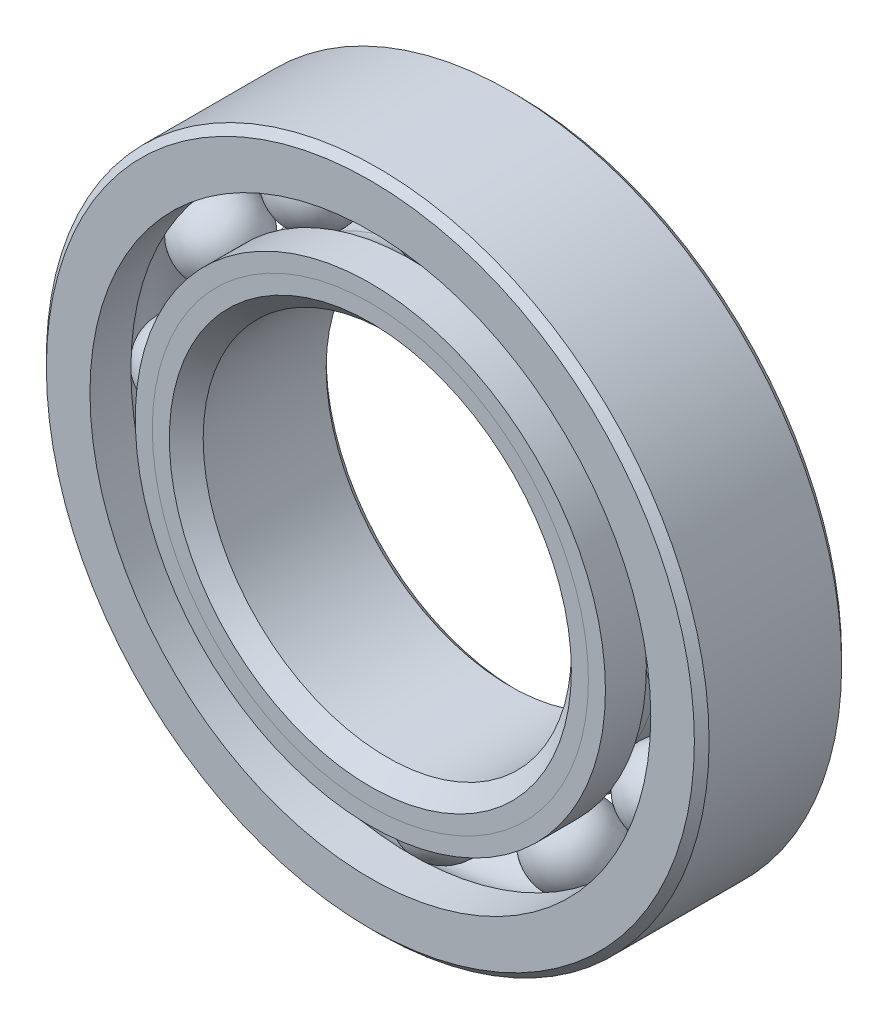
ISO-10303-21;
HEADER;
FILE_DESCRIPTION(('STEP AP214'),'2;1');
FILE_NAME('part.step','',(''),(''),'','','');
FILE_SCHEMA(('AUTOMOTIVE_DESIGN { 1 0 10303 214 1 1 1 1 }'));
ENDSEC;
DATA;
#1=APPLICATION_CONTEXT('core data for automotive mechanical design processes');
#2=APPLICATION_PROTOCOL_DEFINITION('international standard','automotive_design',2000,#1);
#3=PRODUCT_CONTEXT('',#1,'mechanical');
#4=PRODUCT('Part','Part','',(#3));
#5=PRODUCT_RELATED_PRODUCT_CATEGORY('part','',(#4));
#6=PRODUCT_DEFINITION_FORMATION('','',#4);
#7=PRODUCT_DEFINITION_CONTEXT('part definition',#1,'design');
#8=PRODUCT_DEFINITION('design','',#6,#7);
#9=PRODUCT_DEFINITION_SHAPE('','',#8);
#10=(LENGTH_UNIT() NAMED_UNIT(*) SI_UNIT(.MILLI.,.METRE.));
#11=(NAMED_UNIT(*) PLANE_ANGLE_UNIT() SI_UNIT($,.RADIAN.));
#12=(NAMED_UNIT(*) SI_UNIT($,.STERADIAN.) SOLID_ANGLE_UNIT());
#13=UNCERTAINTY_MEASURE_WITH_UNIT(LENGTH_MEASURE(1.E-05),#10,'distance_accuracy_value','');
#14=(GEOMETRIC_REPRESENTATION_CONTEXT(3) GLOBAL_UNCERTAINTY_ASSIGNED_CONTEXT((#13)) GLOBAL_UNIT_ASSIGNED_CONTEXT((#10,
#11,#12)) REPRESENTATION_CONTEXT('',''));
#15=CARTESIAN_POINT('',(0.,0.,0.));
#16=DIRECTION('',(0.,0.,1.));
#17=DIRECTION('',(1.,0.,0.));
#18=AXIS2_PLACEMENT_3D('',#15,#16,#17);
#19=CARTESIAN_POINT('',(-5.55624999999988,9.62370729955465,0.));
#20=DIRECTION('',(0.,0.,1.));
#21=DIRECTION('',(-0.499999999999989,0.866025403784445,0.));
#22=AXIS2_PLACEMENT_3D('',#19,#20,#21);
#23=SPHERICAL_SURFACE('',#22,1.71627890103155);
#24=CARTESIAN_POINT('',(-5.55624999999988,9.62370729955465,1.71627890103155));
#25=VERTEX_POINT('',#24);
#26=VERTEX_LOOP('',#25);
#27=FACE_BOUND('',#26,.T.);
#28=ADVANCED_FACE('F41',(#27),#23,.T.);
#29=CLOSED_SHELL('',(#28));
#30=MANIFOLD_SOLID_BREP('B2',#29);
#31=CARTESIAN_POINT('',(-9.62370729955451,5.55625000000011,0.));
#32=DIRECTION('',(0.,0.,1.));
#33=DIRECTION('',(-0.866025403784433,0.50000000000001,0.));
#34=AXIS2_PLACEMENT_3D('',#31,#32,#33);
#35=SPHERICAL_SURFACE('',#34,1.71627890103155);
#36=CARTESIAN_POINT('',(-9.62370729955451,5.55625000000011,1.71627890103155));
#37=VERTEX_POINT('',#36);
#38=VERTEX_LOOP('',#37);
#39=FACE_BOUND('',#38,.T.);
#40=ADVANCED_FACE('F76',(#39),#35,.T.);
#41=CLOSED_SHELL('',(#40));
#42=MANIFOLD_SOLID_BREP('B6',#41);
#43=CARTESIAN_POINT('',(-11.1125,1.16397259133683E-13,0.));
#44=DIRECTION('',(0.,0.,1.));
#45=DIRECTION('',(-1.,0.,0.));
#46=AXIS2_PLACEMENT_3D('',#43,#44,#45);
#47=SPHERICAL_SURFACE('',#46,1.71627890103155);
#48=CARTESIAN_POINT('',(-11.1125,1.16397259133683E-13,1.71627890103155));
#49=VERTEX_POINT('',#48);
#50=VERTEX_LOOP('',#49);
#51=FACE_BOUND('',#50,.T.);
#52=ADVANCED_FACE('F111',(#51),#47,.T.);
#53=CLOSED_SHELL('',(#52));
#54=MANIFOLD_SOLID_BREP('B37',#53);
#55=CARTESIAN_POINT('',(-9.62370729955463,-5.55624999999991,0.));
#56=DIRECTION('',(0.,0.,1.));
#57=DIRECTION('',(-0.866025403784443,-0.499999999999992,0.));
#58=AXIS2_PLACEMENT_3D('',#55,#56,#57);
#59=SPHERICAL_SURFACE('',#58,1.71627890103155);
#60=CARTESIAN_POINT('',(-9.62370729955463,-5.55624999999991,1.71627890103155));
#61=VERTEX_POINT('',#60);
#62=VERTEX_LOOP('',#61);
#63=FACE_BOUND('',#62,.T.);
#64=ADVANCED_FACE('F146',(#63),#59,.T.);
#65=CLOSED_SHELL('',(#64));
#66=MANIFOLD_SOLID_BREP('B72',#65);
#67=CARTESIAN_POINT('',(-5.55625000000008,-9.62370729955453,0.));
#68=DIRECTION('',(0.,0.,1.));
#69=DIRECTION('',(-0.500000000000007,-0.866025403784435,0.));
#70=AXIS2_PLACEMENT_3D('',#67,#68,#69);
#71=SPHERICAL_SURFACE('',#70,1.71627890103155);
#72=CARTESIAN_POINT('',(-5.55625000000008,-9.62370729955453,1.71627890103155));
#73=VERTEX_POINT('',#72);
#74=VERTEX_LOOP('',#73);
#75=FACE_BOUND('',#74,.T.);
#76=ADVANCED_FACE('F181',(#75),#71,.T.);
#77=CLOSED_SHELL('',(#76));
#78=MANIFOLD_SOLID_BREP('B107',#77);
#79=CARTESIAN_POINT('',(0.,-11.1125,0.));
#80=DIRECTION('',(0.,0.,1.));
#81=DIRECTION('',(0.,-1.,0.));
#82=AXIS2_PLACEMENT_3D('',#79,#80,#81);
#83=SPHERICAL_SURFACE('',#82,1.71627890103155);
#84=CARTESIAN_POINT('',(0.,-11.1125,1.71627890103155));
#85=VERTEX_POINT('',#84);
#86=VERTEX_LOOP('',#85);
#87=FACE_BOUND('',#86,.T.);
#88=ADVANCED_FACE('F216',(#87),#83,.T.);
#89=CLOSED_SHELL('',(#88));
#90=MANIFOLD_SOLID_BREP('B142',#89);
#91=CARTESIAN_POINT('',(5.55624999999994,-9.62370729955461,0.));
#92=DIRECTION('',(0.,0.,1.));
#93=DIRECTION('',(0.499999999999995,-0.866025403784442,0.));
#94=AXIS2_PLACEMENT_3D('',#91,#92,#93);
#95=SPHERICAL_SURFACE('',#94,1.71627890103155);
#96=CARTESIAN_POINT('',(5.55624999999994,-9.62370729955461,1.71627890103155));
#97=VERTEX_POINT('',#96);
#98=VERTEX_LOOP('',#97);
#99=FACE_BOUND('',#98,.T.);
#100=ADVANCED_FACE('F251',(#99),#95,.T.);
#101=CLOSED_SHELL('',(#100));
#102=MANIFOLD_SOLID_BREP('B177',#101);
#103=CARTESIAN_POINT('',(9.62370729955455,-5.55625000000005,0.));
#104=DIRECTION('',(0.,0.,1.));
#105=DIRECTION('',(0.866025403784436,-0.500000000000004,0.));
#106=AXIS2_PLACEMENT_3D('',#103,#104,#105);
#107=SPHERICAL_SURFACE('',#106,1.71627890103155);
#108=CARTESIAN_POINT('',(9.62370729955455,-5.55625000000005,1.71627890103155));
#109=VERTEX_POINT('',#108);
#110=VERTEX_LOOP('',#109);
#111=FACE_BOUND('',#110,.T.);
#112=ADVANCED_FACE('F286',(#111),#107,.T.);
#113=CLOSED_SHELL('',(#112));
#114=MANIFOLD_SOLID_BREP('B212',#113);
#115=CARTESIAN_POINT('',(11.1125,0.,0.));
#116=DIRECTION('',(0.,0.,1.));
#117=DIRECTION('',(1.,0.,0.));
#118=AXIS2_PLACEMENT_3D('',#115,#116,#117);
#119=SPHERICAL_SURFACE('',#118,1.71627890103155);
#120=CARTESIAN_POINT('',(11.1125,0.,1.71627890103155));
#121=VERTEX_POINT('',#120);
#122=VERTEX_LOOP('',#121);
#123=FACE_BOUND('',#122,.T.);
#124=ADVANCED_FACE('F321',(#123),#119,.T.);
#125=CLOSED_SHELL('',(#124));
#126=MANIFOLD_SOLID_BREP('B247',#125);
#127=CARTESIAN_POINT('',(9.62370729955459,5.55624999999998,0.));
#128=DIRECTION('',(0.,0.,1.));
#129=DIRECTION('',(0.86602540378444,0.499999999999998,0.));
#130=AXIS2_PLACEMENT_3D('',#127,#128,#129);
#131=SPHERICAL_SURFACE('',#130,1.71627890103155);
#132=CARTESIAN_POINT('',(9.62370729955459,5.55624999999998,1.71627890103155));
#133=VERTEX_POINT('',#132);
#134=VERTEX_LOOP('',#133);
#135=FACE_BOUND('',#134,.T.);
#136=ADVANCED_FACE('F356',(#135),#131,.T.);
#137=CLOSED_SHELL('',(#136));
#138=MANIFOLD_SOLID_BREP('B282',#137);
#139=CARTESIAN_POINT('',(5.55625000000001,9.62370729955457,0.));
#140=DIRECTION('',(0.,0.,1.));
#141=DIRECTION('',(0.500000000000001,0.866025403784438,0.));
#142=AXIS2_PLACEMENT_3D('',#139,#140,#141);
#143=SPHERICAL_SURFACE('',#142,1.71627890103155);
#144=CARTESIAN_POINT('',(5.55625000000001,9.62370729955457,1.71627890103155));
#145=VERTEX_POINT('',#144);
#146=VERTEX_LOOP('',#145);
#147=FACE_BOUND('',#146,.T.);
#148=ADVANCED_FACE('F391',(#147),#143,.T.);
#149=CLOSED_SHELL('',(#148));
#150=MANIFOLD_SOLID_BREP('B317',#149);
#151=CARTESIAN_POINT('',(0.,11.1125,0.));
#152=DIRECTION('',(0.,0.,1.));
#153=DIRECTION('',(0.,1.,0.));
#154=AXIS2_PLACEMENT_3D('',#151,#152,#153);
#155=SPHERICAL_SURFACE('',#154,1.71627890103155);
#156=CARTESIAN_POINT('',(0.,11.1125,1.71627890103155));
#157=VERTEX_POINT('',#156);
#158=VERTEX_LOOP('',#157);
#159=FACE_BOUND('',#158,.T.);
#160=ADVANCED_FACE('F428',(#159),#155,.T.);
#161=CLOSED_SHELL('',(#160));
#162=MANIFOLD_SOLID_BREP('B352',#161);
#163=CARTESIAN_POINT('',(0.,9.40121873628058,3.175));
#164=DIRECTION('',(0.,0.,-1.));
#165=DIRECTION('',(-1.,0.,0.));
#166=AXIS2_PLACEMENT_3D('',#163,#164,#165);
#167=PLANE('',#166);
#168=CARTESIAN_POINT('',(0.,0.,3.175));
#169=DIRECTION('',(0.,0.,1.));
#170=DIRECTION('',(1.,0.,0.));
#171=AXIS2_PLACEMENT_3D('',#168,#169,#170);
#172=CIRCLE('',#171,8.66686054948422);
#173=CARTESIAN_POINT('',(8.66686054948422,0.,3.175));
#174=VERTEX_POINT('',#173);
#175=EDGE_CURVE('E484',#174,#174,#172,.T.);
#176=ORIENTED_EDGE('',*,*,#175,.F.);
#177=EDGE_LOOP('',(#176));
#178=FACE_BOUND('',#177,.T.);
#179=CARTESIAN_POINT('',(0.,0.,3.175));
#180=DIRECTION('',(0.,0.,1.));
#181=DIRECTION('',(1.,0.,0.));
#182=AXIS2_PLACEMENT_3D('',#179,#180,#181);
#183=CIRCLE('',#182,9.40121873628058);
#184=CARTESIAN_POINT('',(9.40121873628058,0.,3.175));
#185=VERTEX_POINT('',#184);
#186=EDGE_CURVE('E427',#185,#185,#183,.T.);
#187=ORIENTED_EDGE('',*,*,#186,.T.);
#188=EDGE_LOOP('',(#187));
#189=FACE_BOUND('',#188,.T.);
#190=ADVANCED_FACE('F450',(#178,#189),#167,.F.);
#191=CARTESIAN_POINT('',(0.,0.,2.44064181320365));
#192=DIRECTION('',(0.,0.,1.));
#193=DIRECTION('',(1.,0.,0.));
#194=AXIS2_PLACEMENT_3D('',#191,#192,#193);
#195=CONICAL_SURFACE('',#194,8.66686054948422,0.785398163397451);
#196=ORIENTED_EDGE('',*,*,#186,.F.);
#197=EDGE_LOOP('',(#196));
#198=FACE_BOUND('',#197,.T.);
#199=CARTESIAN_POINT('',(0.,0.,2.44064181320365));
#200=DIRECTION('',(0.,0.,1.));
#201=DIRECTION('',(1.,0.,0.));
#202=AXIS2_PLACEMENT_3D('',#199,#200,#201);
#203=CIRCLE('',#202,8.66686054948422);
#204=CARTESIAN_POINT('',(8.66686054948422,0.,2.44064181320365));
#205=VERTEX_POINT('',#204);
#206=EDGE_CURVE('E456',#205,#205,#203,.T.);
#207=ORIENTED_EDGE('',*,*,#206,.T.);
#208=EDGE_LOOP('',(#207));
#209=FACE_BOUND('',#208,.T.);
#210=ADVANCED_FACE('F491',(#198,#209),#195,.T.);
#211=CARTESIAN_POINT('',(0.,0.,3.175));
#212=DIRECTION('',(0.,0.,1.));
#213=DIRECTION('',(1.,0.,0.));
#214=AXIS2_PLACEMENT_3D('',#211,#212,#213);
#215=CYLINDRICAL_SURFACE('',#214,8.66686054948422);
#216=ORIENTED_EDGE('',*,*,#206,.F.);
#217=EDGE_LOOP('',(#216));
#218=FACE_BOUND('',#217,.T.);
#219=CARTESIAN_POINT('',(0.,0.,0.));
#220=DIRECTION('',(0.,0.,1.));
#221=DIRECTION('',(1.,0.,0.));
#222=AXIS2_PLACEMENT_3D('',#219,#220,#221);
#223=CIRCLE('',#222,8.66686054948422);
#224=CARTESIAN_POINT('',(8.66686054948422,0.,0.));
#225=VERTEX_POINT('',#224);
#226=EDGE_CURVE('E460',#225,#225,#223,.T.);
#227=ORIENTED_EDGE('',*,*,#226,.T.);
#228=EDGE_LOOP('',(#227));
#229=FACE_BOUND('',#228,.T.);
#230=ADVANCED_FACE('F495',(#218,#229),#215,.T.);
#231=CARTESIAN_POINT('',(0.,8.66686054948422,0.));
#232=DIRECTION('',(0.,0.,-1.));
#233=DIRECTION('',(-1.,0.,0.));
#234=AXIS2_PLACEMENT_3D('',#231,#232,#233);
#235=PLANE('',#234);
#236=ORIENTED_EDGE('',*,*,#226,.F.);
#237=EDGE_LOOP('',(#236));
#238=FACE_BOUND('',#237,.T.);
#239=CARTESIAN_POINT('',(0.,0.,0.));
#240=DIRECTION('',(0.,0.,1.));
#241=DIRECTION('',(1.,0.,0.));
#242=AXIS2_PLACEMENT_3D('',#239,#240,#241);
#243=CIRCLE('',#242,9.39622109896845);
#244=CARTESIAN_POINT('',(9.39622109896845,0.,0.));
#245=VERTEX_POINT('',#244);
#246=EDGE_CURVE('E464',#245,#245,#243,.T.);
#247=ORIENTED_EDGE('',*,*,#246,.T.);
#248=EDGE_LOOP('',(#247));
#249=FACE_BOUND('',#248,.T.);
#250=ADVANCED_FACE('F500',(#238,#249),#235,.F.);
#251=CARTESIAN_POINT('',(0.,0.,0.));
#252=DIRECTION('',(0.,0.,1.));
#253=DIRECTION('',(1.,0.,0.));
#254=AXIS2_PLACEMENT_3D('',#251,#252,#253);
#255=TOROIDAL_SURFACE('',#254,11.1125,1.71627890103155);
#256=ORIENTED_EDGE('',*,*,#246,.F.);
#257=EDGE_LOOP('',(#256));
#258=FACE_BOUND('',#257,.T.);
#259=CARTESIAN_POINT('',(0.,0.,-1.41111111111111));
#260=DIRECTION('',(0.,0.,1.));
#261=DIRECTION('',(1.,0.,0.));
#262=AXIS2_PLACEMENT_3D('',#259,#260,#261);
#263=CIRCLE('',#262,10.1355769230769);
#264=CARTESIAN_POINT('',(10.1355769230769,0.,-1.41111111111111));
#265=VERTEX_POINT('',#264);
#266=EDGE_CURVE('E469',#265,#265,#263,.T.);
#267=ORIENTED_EDGE('',*,*,#266,.T.);
#268=EDGE_LOOP('',(#267));
#269=FACE_BOUND('',#268,.T.);
#270=ADVANCED_FACE('F506',(#258,#269),#255,.F.);
#271=CARTESIAN_POINT('',(0.,0.,3.175));
#272=DIRECTION('',(0.,0.,1.));
#273=DIRECTION('',(1.,0.,0.));
#274=AXIS2_PLACEMENT_3D('',#271,#272,#273);
#275=CYLINDRICAL_SURFACE('',#274,10.1355769230769);
#276=ORIENTED_EDGE('',*,*,#266,.F.);
#277=EDGE_LOOP('',(#276));
#278=FACE_BOUND('',#277,.T.);
#279=CARTESIAN_POINT('',(0.,0.,-3.175));
#280=DIRECTION('',(0.,0.,1.));
#281=DIRECTION('',(1.,0.,0.));
#282=AXIS2_PLACEMENT_3D('',#279,#280,#281);
#283=CIRCLE('',#282,10.1355769230769);
#284=CARTESIAN_POINT('',(10.1355769230769,0.,-3.175));
#285=VERTEX_POINT('',#284);
#286=EDGE_CURVE('E472',#285,#285,#283,.T.);
#287=ORIENTED_EDGE('',*,*,#286,.T.);
#288=EDGE_LOOP('',(#287));
#289=FACE_BOUND('',#288,.T.);
#290=ADVANCED_FACE('F510',(#278,#289),#275,.T.);
#291=CARTESIAN_POINT('',(0.,8.255,-3.175));
#292=DIRECTION('',(0.,0.,1.));
#293=DIRECTION('',(1.,0.,0.));
#294=AXIS2_PLACEMENT_3D('',#291,#292,#293);
#295=PLANE('',#294);
#296=ORIENTED_EDGE('',*,*,#286,.F.);
#297=EDGE_LOOP('',(#296));
#298=FACE_BOUND('',#297,.T.);
#299=CARTESIAN_POINT('',(0.,0.,-3.175));
#300=DIRECTION('',(0.,0.,1.));
#301=DIRECTION('',(1.,0.,0.));
#302=AXIS2_PLACEMENT_3D('',#299,#300,#301);
#303=CIRCLE('',#302,8.255);
#304=CARTESIAN_POINT('',(8.255,0.,-3.175));
#305=VERTEX_POINT('',#304);
#306=EDGE_CURVE('E475',#305,#305,#303,.T.);
#307=ORIENTED_EDGE('',*,*,#306,.T.);
#308=EDGE_LOOP('',(#307));
#309=FACE_BOUND('',#308,.T.);
#310=ADVANCED_FACE('F514',(#298,#309),#295,.F.);
#311=CARTESIAN_POINT('',(0.,0.,-2.8575));
#312=DIRECTION('',(0.,0.,-1.));
#313=DIRECTION('',(-1.,0.,0.));
#314=AXIS2_PLACEMENT_3D('',#311,#312,#313);
#315=CONICAL_SURFACE('',#314,7.9375,0.785398163397442);
#316=ORIENTED_EDGE('',*,*,#306,.F.);
#317=EDGE_LOOP('',(#316));
#318=FACE_BOUND('',#317,.T.);
#319=CARTESIAN_POINT('',(0.,0.,-2.8575));
#320=DIRECTION('',(0.,0.,1.));
#321=DIRECTION('',(1.,0.,0.));
#322=AXIS2_PLACEMENT_3D('',#319,#320,#321);
#323=CIRCLE('',#322,7.9375);
#324=CARTESIAN_POINT('',(7.9375,0.,-2.8575));
#325=VERTEX_POINT('',#324);
#326=EDGE_CURVE('E478',#325,#325,#323,.T.);
#327=ORIENTED_EDGE('',*,*,#326,.T.);
#328=EDGE_LOOP('',(#327));
#329=FACE_BOUND('',#328,.T.);
#330=ADVANCED_FACE('F518',(#318,#329),#315,.F.);
#331=CARTESIAN_POINT('',(0.,0.,3.175));
#332=DIRECTION('',(0.,0.,1.));
#333=DIRECTION('',(1.,0.,0.));
#334=AXIS2_PLACEMENT_3D('',#331,#332,#333);
#335=CYLINDRICAL_SURFACE('',#334,7.9375);
#336=ORIENTED_EDGE('',*,*,#326,.F.);
#337=EDGE_LOOP('',(#336));
#338=FACE_BOUND('',#337,.T.);
#339=CARTESIAN_POINT('',(0.,0.,2.44563945051578));
#340=DIRECTION('',(0.,0.,1.));
#341=DIRECTION('',(1.,0.,0.));
#342=AXIS2_PLACEMENT_3D('',#339,#340,#341);
#343=CIRCLE('',#342,7.9375);
#344=CARTESIAN_POINT('',(7.9375,0.,2.44563945051578));
#345=VERTEX_POINT('',#344);
#346=EDGE_CURVE('E481',#345,#345,#343,.T.);
#347=ORIENTED_EDGE('',*,*,#346,.T.);
#348=EDGE_LOOP('',(#347));
#349=FACE_BOUND('',#348,.T.);
#350=ADVANCED_FACE('F522',(#338,#349),#335,.F.);
#351=CARTESIAN_POINT('',(0.,0.,3.175));
#352=DIRECTION('',(0.,0.,1.));
#353=DIRECTION('',(1.,0.,0.));
#354=AXIS2_PLACEMENT_3D('',#351,#352,#353);
#355=CONICAL_SURFACE('',#354,8.66686054948422,0.785398163397451);
#356=ORIENTED_EDGE('',*,*,#346,.F.);
#357=EDGE_LOOP('',(#356));
#358=FACE_BOUND('',#357,.T.);
#359=ORIENTED_EDGE('',*,*,#175,.T.);
#360=EDGE_LOOP('',(#359));
#361=FACE_BOUND('',#360,.T.);
#362=ADVANCED_FACE('F488',(#358,#361),#355,.F.);
#363=CLOSED_SHELL('',(#190,#210,#230,#250,#270,#290,#310,#330,#350,#362));
#364=MANIFOLD_SOLID_BREP('B387',#363);
#365=CARTESIAN_POINT('',(0.,10.1355769230769,3.175));
#366=DIRECTION('',(0.,0.,-1.));
#367=DIRECTION('',(-1.,0.,0.));
#368=AXIS2_PLACEMENT_3D('',#365,#366,#367);
#369=PLANE('',#368);
#370=CARTESIAN_POINT('',(0.,0.,3.175));
#371=DIRECTION('',(0.,0.,1.));
#372=DIRECTION('',(1.,0.,0.));
#373=AXIS2_PLACEMENT_3D('',#370,#371,#372);
#374=CIRCLE('',#373,9.40121873628058);
#375=CARTESIAN_POINT('',(9.40121873628058,0.,3.175));
#376=VERTEX_POINT('',#375);
#377=EDGE_CURVE('E449',#376,#376,#374,.T.);
#378=ORIENTED_EDGE('',*,*,#377,.F.);
#379=EDGE_LOOP('',(#378));
#380=FACE_BOUND('',#379,.T.);
#381=CARTESIAN_POINT('',(0.,0.,3.175));
#382=DIRECTION('',(0.,0.,1.));
#383=DIRECTION('',(1.,0.,0.));
#384=AXIS2_PLACEMENT_3D('',#381,#382,#383);
#385=CIRCLE('',#384,10.1355769230769);
#386=CARTESIAN_POINT('',(10.1355769230769,0.,3.175));
#387=VERTEX_POINT('',#386);
#388=EDGE_CURVE('E650',#387,#387,#385,.T.);
#389=ORIENTED_EDGE('',*,*,#388,.T.);
#390=EDGE_LOOP('',(#389));
#391=FACE_BOUND('',#390,.T.);
#392=ADVANCED_FACE('F628',(#380,#391),#369,.F.);
#393=CARTESIAN_POINT('',(0.,0.,3.175));
#394=DIRECTION('',(0.,0.,1.));
#395=DIRECTION('',(1.,0.,0.));
#396=AXIS2_PLACEMENT_3D('',#393,#394,#395);
#397=CONICAL_SURFACE('',#396,9.40121873628058,0.785398163397451);
#398=CARTESIAN_POINT('',(0.,0.,2.44064181320365));
#399=DIRECTION('',(0.,0.,1.));
#400=DIRECTION('',(1.,0.,0.));
#401=AXIS2_PLACEMENT_3D('',#398,#399,#400);
#402=CIRCLE('',#401,8.66686054948422);
#403=CARTESIAN_POINT('',(8.66686054948422,0.,2.44064181320365));
#404=VERTEX_POINT('',#403);
#405=EDGE_CURVE('E634',#404,#404,#402,.T.);
#406=ORIENTED_EDGE('',*,*,#405,.F.);
#407=EDGE_LOOP('',(#406));
#408=FACE_BOUND('',#407,.T.);
#409=ORIENTED_EDGE('',*,*,#377,.T.);
#410=EDGE_LOOP('',(#409));
#411=FACE_BOUND('',#410,.T.);
#412=ADVANCED_FACE('F675',(#408,#411),#397,.F.);
#413=CARTESIAN_POINT('',(0.,0.,3.175));
#414=DIRECTION('',(0.,0.,1.));
#415=DIRECTION('',(1.,0.,0.));
#416=AXIS2_PLACEMENT_3D('',#413,#414,#415);
#417=CYLINDRICAL_SURFACE('',#416,8.66686054948422);
#418=CARTESIAN_POINT('',(0.,0.,0.));
#419=DIRECTION('',(0.,0.,1.));
#420=DIRECTION('',(1.,0.,0.));
#421=AXIS2_PLACEMENT_3D('',#418,#419,#420);
#422=CIRCLE('',#421,8.66686054948422);
#423=CARTESIAN_POINT('',(8.66686054948422,0.,0.));
#424=VERTEX_POINT('',#423);
#425=EDGE_CURVE('E638',#424,#424,#422,.T.);
#426=ORIENTED_EDGE('',*,*,#425,.F.);
#427=EDGE_LOOP('',(#426));
#428=FACE_BOUND('',#427,.T.);
#429=ORIENTED_EDGE('',*,*,#405,.T.);
#430=EDGE_LOOP('',(#429));
#431=FACE_BOUND('',#430,.T.);
#432=ADVANCED_FACE('F670',(#428,#431),#417,.F.);
#433=CARTESIAN_POINT('',(0.,8.66686054948422,0.));
#434=DIRECTION('',(0.,0.,1.));
#435=DIRECTION('',(1.,0.,0.));
#436=AXIS2_PLACEMENT_3D('',#433,#434,#435);
#437=PLANE('',#436);
#438=CARTESIAN_POINT('',(0.,0.,0.));
#439=DIRECTION('',(0.,0.,1.));
#440=DIRECTION('',(1.,0.,0.));
#441=AXIS2_PLACEMENT_3D('',#438,#439,#440);
#442=CIRCLE('',#441,9.39622109896845);
#443=CARTESIAN_POINT('',(9.39622109896845,0.,0.));
#444=VERTEX_POINT('',#443);
#445=EDGE_CURVE('E642',#444,#444,#442,.T.);
#446=ORIENTED_EDGE('',*,*,#445,.F.);
#447=EDGE_LOOP('',(#446));
#448=FACE_BOUND('',#447,.T.);
#449=ORIENTED_EDGE('',*,*,#425,.T.);
#450=EDGE_LOOP('',(#449));
#451=FACE_BOUND('',#450,.T.);
#452=ADVANCED_FACE('F664',(#448,#451),#437,.F.);
#453=CARTESIAN_POINT('',(0.,0.,0.));
#454=DIRECTION('',(0.,0.,1.));
#455=DIRECTION('',(1.,0.,0.));
#456=AXIS2_PLACEMENT_3D('',#453,#454,#455);
#457=TOROIDAL_SURFACE('',#456,11.1125,1.71627890103155);
#458=CARTESIAN_POINT('',(0.,0.,1.41111111111111));
#459=DIRECTION('',(0.,0.,1.));
#460=DIRECTION('',(1.,0.,0.));
#461=AXIS2_PLACEMENT_3D('',#458,#459,#460);
#462=CIRCLE('',#461,10.1355769230769);
#463=CARTESIAN_POINT('',(10.1355769230769,0.,1.41111111111111));
#464=VERTEX_POINT('',#463);
#465=EDGE_CURVE('E647',#464,#464,#462,.T.);
#466=ORIENTED_EDGE('',*,*,#465,.F.);
#467=EDGE_LOOP('',(#466));
#468=FACE_BOUND('',#467,.T.);
#469=ORIENTED_EDGE('',*,*,#445,.T.);
#470=EDGE_LOOP('',(#469));
#471=FACE_BOUND('',#470,.T.);
#472=ADVANCED_FACE('F658',(#468,#471),#457,.F.);
#473=CARTESIAN_POINT('',(0.,0.,3.175));
#474=DIRECTION('',(0.,0.,1.));
#475=DIRECTION('',(1.,0.,0.));
#476=AXIS2_PLACEMENT_3D('',#473,#474,#475);
#477=CYLINDRICAL_SURFACE('',#476,10.1355769230769);
#478=ORIENTED_EDGE('',*,*,#388,.F.);
#479=EDGE_LOOP('',(#478));
#480=FACE_BOUND('',#479,.T.);
#481=ORIENTED_EDGE('',*,*,#465,.T.);
#482=EDGE_LOOP('',(#481));
#483=FACE_BOUND('',#482,.T.);
#484=ADVANCED_FACE('F655',(#480,#483),#477,.T.);
#485=CLOSED_SHELL('',(#392,#412,#432,#452,#472,#484));
#486=MANIFOLD_SOLID_BREP('B422',#485);
#487=CARTESIAN_POINT('',(0.,0.,2.8575));
#488=DIRECTION('',(0.,0.,-1.));
#489=DIRECTION('',(-1.,0.,0.));
#490=AXIS2_PLACEMENT_3D('',#487,#488,#489);
#491=CONICAL_SURFACE('',#490,14.2875,0.785398163397446);
#492=CARTESIAN_POINT('',(0.,0.,3.175));
#493=DIRECTION('',(0.,0.,1.));
#494=DIRECTION('',(1.,0.,0.));
#495=AXIS2_PLACEMENT_3D('',#492,#493,#494);
#496=CIRCLE('',#495,13.97);
#497=CARTESIAN_POINT('',(13.97,0.,3.175));
#498=VERTEX_POINT('',#497);
#499=EDGE_CURVE('E759',#498,#498,#496,.T.);
#500=ORIENTED_EDGE('',*,*,#499,.F.);
#501=EDGE_LOOP('',(#500));
#502=FACE_BOUND('',#501,.T.);
#503=CARTESIAN_POINT('',(0.,0.,2.8575));
#504=DIRECTION('',(0.,0.,1.));
#505=DIRECTION('',(1.,0.,0.));
#506=AXIS2_PLACEMENT_3D('',#503,#504,#505);
#507=CIRCLE('',#506,14.2875);
#508=CARTESIAN_POINT('',(14.2875,0.,2.8575));
#509=VERTEX_POINT('',#508);
#510=EDGE_CURVE('E627',#509,#509,#507,.T.);
#511=ORIENTED_EDGE('',*,*,#510,.T.);
#512=EDGE_LOOP('',(#511));
#513=FACE_BOUND('',#512,.T.);
#514=ADVANCED_FACE('F731',(#502,#513),#491,.T.);
#515=CARTESIAN_POINT('',(0.,0.,3.175));
#516=DIRECTION('',(0.,0.,1.));
#517=DIRECTION('',(1.,0.,0.));
#518=AXIS2_PLACEMENT_3D('',#515,#516,#517);
#519=CYLINDRICAL_SURFACE('',#518,14.2875);
#520=ORIENTED_EDGE('',*,*,#510,.F.);
#521=EDGE_LOOP('',(#520));
#522=FACE_BOUND('',#521,.T.);
#523=CARTESIAN_POINT('',(0.,0.,-2.8575));
#524=DIRECTION('',(0.,0.,1.));
#525=DIRECTION('',(1.,0.,0.));
#526=AXIS2_PLACEMENT_3D('',#523,#524,#525);
#527=CIRCLE('',#526,14.2875);
#528=CARTESIAN_POINT('',(14.2875,0.,-2.8575));
#529=VERTEX_POINT('',#528);
#530=EDGE_CURVE('E737',#529,#529,#527,.T.);
#531=ORIENTED_EDGE('',*,*,#530,.T.);
#532=EDGE_LOOP('',(#531));
#533=FACE_BOUND('',#532,.T.);
#534=ADVANCED_FACE('F766',(#522,#533),#519,.T.);
#535=CARTESIAN_POINT('',(0.,0.,-3.175));
#536=DIRECTION('',(0.,0.,1.));
#537=DIRECTION('',(1.,0.,0.));
#538=AXIS2_PLACEMENT_3D('',#535,#536,#537);
#539=CONICAL_SURFACE('',#538,13.97,0.785398163397446);
#540=ORIENTED_EDGE('',*,*,#530,.F.);
#541=EDGE_LOOP('',(#540));
#542=FACE_BOUND('',#541,.T.);
#543=CARTESIAN_POINT('',(0.,0.,-3.175));
#544=DIRECTION('',(0.,0.,1.));
#545=DIRECTION('',(1.,0.,0.));
#546=AXIS2_PLACEMENT_3D('',#543,#544,#545);
#547=CIRCLE('',#546,13.97);
#548=CARTESIAN_POINT('',(13.97,0.,-3.175));
#549=VERTEX_POINT('',#548);
#550=EDGE_CURVE('E741',#549,#549,#547,.T.);
#551=ORIENTED_EDGE('',*,*,#550,.T.);
#552=EDGE_LOOP('',(#551));
#553=FACE_BOUND('',#552,.T.);
#554=ADVANCED_FACE('F770',(#542,#553),#539,.T.);
#555=CARTESIAN_POINT('',(0.,13.97,-3.175));
#556=DIRECTION('',(0.,0.,1.));
#557=DIRECTION('',(1.,0.,0.));
#558=AXIS2_PLACEMENT_3D('',#555,#556,#557);
#559=PLANE('',#558);
#560=ORIENTED_EDGE('',*,*,#550,.F.);
#561=EDGE_LOOP('',(#560));
#562=FACE_BOUND('',#561,.T.);
#563=CARTESIAN_POINT('',(0.,0.,-3.175));
#564=DIRECTION('',(0.,0.,1.));
#565=DIRECTION('',(1.,0.,0.));
#566=AXIS2_PLACEMENT_3D('',#563,#564,#565);
#567=CIRCLE('',#566,12.0894230769231);
#568=CARTESIAN_POINT('',(12.0894230769231,0.,-3.175));
#569=VERTEX_POINT('',#568);
#570=EDGE_CURVE('E745',#569,#569,#567,.T.);
#571=ORIENTED_EDGE('',*,*,#570,.T.);
#572=EDGE_LOOP('',(#571));
#573=FACE_BOUND('',#572,.T.);
#574=ADVANCED_FACE('F775',(#562,#573),#559,.F.);
#575=CARTESIAN_POINT('',(0.,0.,3.175));
#576=DIRECTION('',(0.,0.,1.));
#577=DIRECTION('',(1.,0.,0.));
#578=AXIS2_PLACEMENT_3D('',#575,#576,#577);
#579=CYLINDRICAL_SURFACE('',#578,12.0894230769231);
#580=ORIENTED_EDGE('',*,*,#570,.F.);
#581=EDGE_LOOP('',(#580));
#582=FACE_BOUND('',#581,.T.);
#583=CARTESIAN_POINT('',(0.,0.,-1.41111111111111));
#584=DIRECTION('',(0.,0.,1.));
#585=DIRECTION('',(1.,0.,0.));
#586=AXIS2_PLACEMENT_3D('',#583,#584,#585);
#587=CIRCLE('',#586,12.0894230769231);
#588=CARTESIAN_POINT('',(12.0894230769231,0.,-1.41111111111111));
#589=VERTEX_POINT('',#588);
#590=EDGE_CURVE('E750',#589,#589,#587,.T.);
#591=ORIENTED_EDGE('',*,*,#590,.T.);
#592=EDGE_LOOP('',(#591));
#593=FACE_BOUND('',#592,.T.);
#594=ADVANCED_FACE('F781',(#582,#593),#579,.F.);
#595=CARTESIAN_POINT('',(0.,0.,0.));
#596=DIRECTION('',(0.,0.,1.));
#597=DIRECTION('',(1.,0.,0.));
#598=AXIS2_PLACEMENT_3D('',#595,#596,#597);
#599=TOROIDAL_SURFACE('',#598,11.1125,1.71627890103155);
#600=ORIENTED_EDGE('',*,*,#590,.F.);
#601=EDGE_LOOP('',(#600));
#602=FACE_BOUND('',#601,.T.);
#603=CARTESIAN_POINT('',(0.,0.,1.41111111111111));
#604=DIRECTION('',(0.,0.,1.));
#605=DIRECTION('',(1.,0.,0.));
#606=AXIS2_PLACEMENT_3D('',#603,#604,#605);
#607=CIRCLE('',#606,12.0894230769231);
#608=CARTESIAN_POINT('',(12.0894230769231,0.,1.41111111111111));
#609=VERTEX_POINT('',#608);
#610=EDGE_CURVE('E753',#609,#609,#607,.T.);
#611=ORIENTED_EDGE('',*,*,#610,.T.);
#612=EDGE_LOOP('',(#611));
#613=FACE_BOUND('',#612,.T.);
#614=ADVANCED_FACE('F785',(#602,#613),#599,.F.);
#615=CARTESIAN_POINT('',(0.,0.,3.175));
#616=DIRECTION('',(0.,0.,1.));
#617=DIRECTION('',(1.,0.,0.));
#618=AXIS2_PLACEMENT_3D('',#615,#616,#617);
#619=CYLINDRICAL_SURFACE('',#618,12.0894230769231);
#620=ORIENTED_EDGE('',*,*,#610,.F.);
#621=EDGE_LOOP('',(#620));
#622=FACE_BOUND('',#621,.T.);
#623=CARTESIAN_POINT('',(0.,0.,3.175));
#624=DIRECTION('',(0.,0.,1.));
#625=DIRECTION('',(1.,0.,0.));
#626=AXIS2_PLACEMENT_3D('',#623,#624,#625);
#627=CIRCLE('',#626,12.0894230769231);
#628=CARTESIAN_POINT('',(12.0894230769231,0.,3.175));
#629=VERTEX_POINT('',#628);
#630=EDGE_CURVE('E756',#629,#629,#627,.T.);
#631=ORIENTED_EDGE('',*,*,#630,.T.);
#632=EDGE_LOOP('',(#631));
#633=FACE_BOUND('',#632,.T.);
#634=ADVANCED_FACE('F789',(#622,#633),#619,.F.);
#635=CARTESIAN_POINT('',(0.,13.97,3.175));
#636=DIRECTION('',(0.,0.,-1.));
#637=DIRECTION('',(-1.,0.,0.));
#638=AXIS2_PLACEMENT_3D('',#635,#636,#637);
#639=PLANE('',#638);
#640=ORIENTED_EDGE('',*,*,#630,.F.);
#641=EDGE_LOOP('',(#640));
#642=FACE_BOUND('',#641,.T.);
#643=ORIENTED_EDGE('',*,*,#499,.T.);
#644=EDGE_LOOP('',(#643));
#645=FACE_BOUND('',#644,.T.);
#646=ADVANCED_FACE('F763',(#642,#645),#639,.F.);
#647=CLOSED_SHELL('',(#514,#534,#554,#574,#594,#614,#634,#646));
#648=MANIFOLD_SOLID_BREP('B444',#647);
#649=ADVANCED_BREP_SHAPE_REPRESENTATION('',(#18,#30,#42,#54,#66,#78,#90,#102,#114,#126,#138,
#150,#162,#364,#486,#648),#14);
#650=SHAPE_DEFINITION_REPRESENTATION(#9,#649);
ENDSEC;
END-ISO-10303-21;
